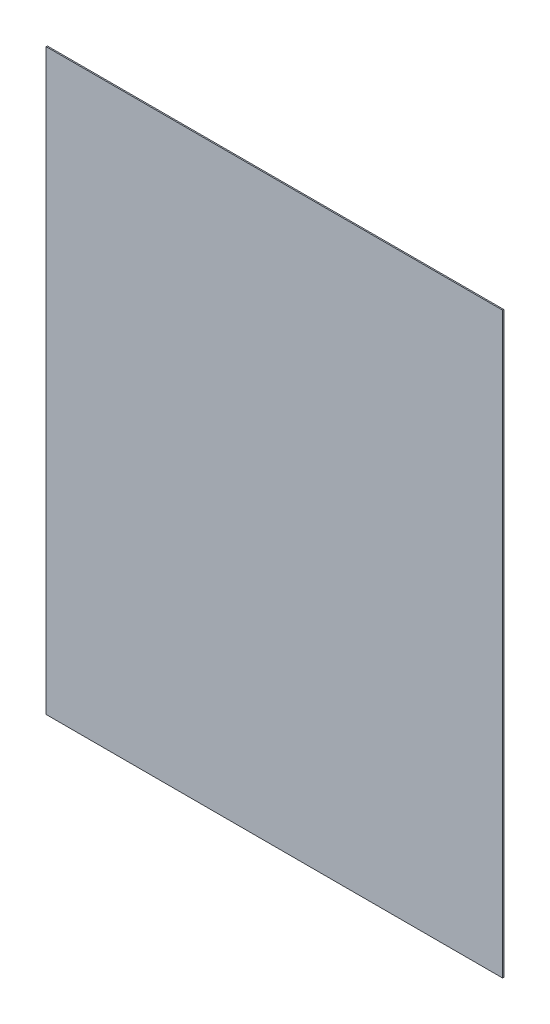
ISO-10303-21;
HEADER;
FILE_DESCRIPTION(('STEP AP214'),'2;1');
FILE_NAME('part.step','',(''),(''),'','','');
FILE_SCHEMA(('AUTOMOTIVE_DESIGN { 1 0 10303 214 1 1 1 1 }'));
ENDSEC;
DATA;
#1=APPLICATION_CONTEXT('core data for automotive mechanical design processes');
#2=APPLICATION_PROTOCOL_DEFINITION('international standard','automotive_design',2000,#1);
#3=PRODUCT_CONTEXT('',#1,'mechanical');
#4=PRODUCT('Part','Part','',(#3));
#5=PRODUCT_RELATED_PRODUCT_CATEGORY('part','',(#4));
#6=PRODUCT_DEFINITION_FORMATION('','',#4);
#7=PRODUCT_DEFINITION_CONTEXT('part definition',#1,'design');
#8=PRODUCT_DEFINITION('design','',#6,#7);
#9=PRODUCT_DEFINITION_SHAPE('','',#8);
#10=(LENGTH_UNIT() NAMED_UNIT(*) SI_UNIT(.MILLI.,.METRE.));
#11=(NAMED_UNIT(*) PLANE_ANGLE_UNIT() SI_UNIT($,.RADIAN.));
#12=(NAMED_UNIT(*) SI_UNIT($,.STERADIAN.) SOLID_ANGLE_UNIT());
#13=UNCERTAINTY_MEASURE_WITH_UNIT(LENGTH_MEASURE(1.E-05),#10,'distance_accuracy_value','');
#14=(GEOMETRIC_REPRESENTATION_CONTEXT(3) GLOBAL_UNCERTAINTY_ASSIGNED_CONTEXT((#13)) GLOBAL_UNIT_ASSIGNED_CONTEXT((#10,
#11,#12)) REPRESENTATION_CONTEXT('',''));
#15=CARTESIAN_POINT('',(0.,0.,0.));
#16=DIRECTION('',(0.,0.,1.));
#17=DIRECTION('',(1.,0.,0.));
#18=AXIS2_PLACEMENT_3D('',#15,#16,#17);
#19=CARTESIAN_POINT('',(355.,450.,1.9));
#20=DIRECTION('',(-1.,0.,0.));
#21=DIRECTION('',(0.,-1.,0.));
#22=AXIS2_PLACEMENT_3D('',#19,#20,#21);
#23=PLANE('',#22);
#24=DIRECTION('',(0.,1.,0.));
#25=VECTOR('',#24,1.);
#26=CARTESIAN_POINT('',(355.,450.,0.));
#27=LINE('',#26,#25);
#28=CARTESIAN_POINT('',(355.,-450.,0.));
#29=VERTEX_POINT('',#28);
#30=CARTESIAN_POINT('',(355.,450.,0.));
#31=VERTEX_POINT('',#30);
#32=EDGE_CURVE('E96',#29,#31,#27,.T.);
#33=ORIENTED_EDGE('',*,*,#32,.T.);
#34=DIRECTION('',(0.,0.,-1.));
#35=VECTOR('',#34,1.);
#36=CARTESIAN_POINT('',(355.,450.,1.9));
#37=LINE('',#36,#35);
#38=CARTESIAN_POINT('',(355.,450.,1.9));
#39=VERTEX_POINT('',#38);
#40=EDGE_CURVE('E11',#39,#31,#37,.T.);
#41=ORIENTED_EDGE('',*,*,#40,.F.);
#42=DIRECTION('',(0.,1.,0.));
#43=VECTOR('',#42,1.);
#44=CARTESIAN_POINT('',(355.,450.,1.9));
#45=LINE('',#44,#43);
#46=CARTESIAN_POINT('',(355.,-450.,1.9));
#47=VERTEX_POINT('',#46);
#48=EDGE_CURVE('E84',#47,#39,#45,.T.);
#49=ORIENTED_EDGE('',*,*,#48,.F.);
#50=DIRECTION('',(0.,0.,-1.));
#51=VECTOR('',#50,1.);
#52=CARTESIAN_POINT('',(355.,-450.,1.9));
#53=LINE('',#52,#51);
#54=EDGE_CURVE('E92',#47,#29,#53,.T.);
#55=ORIENTED_EDGE('',*,*,#54,.T.);
#56=EDGE_LOOP('',(#33,#41,#49,#55));
#57=FACE_BOUND('',#56,.T.);
#58=ADVANCED_FACE('F33',(#57),#23,.F.);
#59=CARTESIAN_POINT('',(-355.,450.,1.9));
#60=DIRECTION('',(0.,-1.,0.));
#61=DIRECTION('',(0.,0.,-1.));
#62=AXIS2_PLACEMENT_3D('',#59,#60,#61);
#63=PLANE('',#62);
#64=DIRECTION('',(-1.,0.,0.));
#65=VECTOR('',#64,1.);
#66=CARTESIAN_POINT('',(-355.,450.,0.));
#67=LINE('',#66,#65);
#68=CARTESIAN_POINT('',(-355.,450.,0.));
#69=VERTEX_POINT('',#68);
#70=EDGE_CURVE('E88',#31,#69,#67,.T.);
#71=ORIENTED_EDGE('',*,*,#70,.T.);
#72=DIRECTION('',(0.,0.,-1.));
#73=VECTOR('',#72,1.);
#74=CARTESIAN_POINT('',(-355.,450.,1.9));
#75=LINE('',#74,#73);
#76=CARTESIAN_POINT('',(-355.,450.,1.9));
#77=VERTEX_POINT('',#76);
#78=EDGE_CURVE('E41',#77,#69,#75,.T.);
#79=ORIENTED_EDGE('',*,*,#78,.F.);
#80=DIRECTION('',(-1.,0.,0.));
#81=VECTOR('',#80,1.);
#82=CARTESIAN_POINT('',(-355.,450.,1.9));
#83=LINE('',#82,#81);
#84=EDGE_CURVE('E79',#39,#77,#83,.T.);
#85=ORIENTED_EDGE('',*,*,#84,.F.);
#86=ORIENTED_EDGE('',*,*,#40,.T.);
#87=EDGE_LOOP('',(#71,#79,#85,#86));
#88=FACE_BOUND('',#87,.T.);
#89=ADVANCED_FACE('F87',(#88),#63,.F.);
#90=CARTESIAN_POINT('',(-355.,450.,1.9));
#91=DIRECTION('',(1.,0.,0.));
#92=DIRECTION('',(0.,1.,0.));
#93=AXIS2_PLACEMENT_3D('',#90,#91,#92);
#94=PLANE('',#93);
#95=DIRECTION('',(0.,-1.,0.));
#96=VECTOR('',#95,1.);
#97=CARTESIAN_POINT('',(-355.,450.,0.));
#98=LINE('',#97,#96);
#99=CARTESIAN_POINT('',(-355.,-450.,0.));
#100=VERTEX_POINT('',#99);
#101=EDGE_CURVE('E66',#69,#100,#98,.T.);
#102=ORIENTED_EDGE('',*,*,#101,.T.);
#103=DIRECTION('',(0.,0.,-1.));
#104=VECTOR('',#103,1.);
#105=CARTESIAN_POINT('',(-355.,-450.,1.9));
#106=LINE('',#105,#104);
#107=CARTESIAN_POINT('',(-355.,-450.,1.9));
#108=VERTEX_POINT('',#107);
#109=EDGE_CURVE('E89',#108,#100,#106,.T.);
#110=ORIENTED_EDGE('',*,*,#109,.F.);
#111=DIRECTION('',(0.,-1.,0.));
#112=VECTOR('',#111,1.);
#113=CARTESIAN_POINT('',(-355.,450.,1.9));
#114=LINE('',#113,#112);
#115=EDGE_CURVE('E82',#77,#108,#114,.T.);
#116=ORIENTED_EDGE('',*,*,#115,.F.);
#117=ORIENTED_EDGE('',*,*,#78,.T.);
#118=EDGE_LOOP('',(#102,#110,#116,#117));
#119=FACE_BOUND('',#118,.T.);
#120=ADVANCED_FACE('F90',(#119),#94,.F.);
#121=CARTESIAN_POINT('',(-355.,-450.,1.9));
#122=DIRECTION('',(0.,1.,0.));
#123=DIRECTION('',(0.,0.,1.));
#124=AXIS2_PLACEMENT_3D('',#121,#122,#123);
#125=PLANE('',#124);
#126=DIRECTION('',(1.,0.,0.));
#127=VECTOR('',#126,1.);
#128=CARTESIAN_POINT('',(-355.,-450.,0.));
#129=LINE('',#128,#127);
#130=EDGE_CURVE('E72',#100,#29,#129,.T.);
#131=ORIENTED_EDGE('',*,*,#130,.T.);
#132=ORIENTED_EDGE('',*,*,#54,.F.);
#133=DIRECTION('',(1.,0.,0.));
#134=VECTOR('',#133,1.);
#135=CARTESIAN_POINT('',(-355.,-450.,1.9));
#136=LINE('',#135,#134);
#137=EDGE_CURVE('E49',#108,#47,#136,.T.);
#138=ORIENTED_EDGE('',*,*,#137,.F.);
#139=ORIENTED_EDGE('',*,*,#109,.T.);
#140=EDGE_LOOP('',(#131,#132,#138,#139));
#141=FACE_BOUND('',#140,.T.);
#142=ADVANCED_FACE('F103',(#141),#125,.F.);
#143=CARTESIAN_POINT('',(0.,0.,1.9));
#144=DIRECTION('',(0.,0.,1.));
#145=DIRECTION('',(1.,0.,0.));
#146=AXIS2_PLACEMENT_3D('',#143,#144,#145);
#147=PLANE('',#146);
#148=ORIENTED_EDGE('',*,*,#48,.T.);
#149=ORIENTED_EDGE('',*,*,#84,.T.);
#150=ORIENTED_EDGE('',*,*,#115,.T.);
#151=ORIENTED_EDGE('',*,*,#137,.T.);
#152=EDGE_LOOP('',(#148,#149,#150,#151));
#153=FACE_BOUND('',#152,.T.);
#154=ADVANCED_FACE('F80',(#153),#147,.T.);
#155=CARTESIAN_POINT('',(0.,0.,0.));
#156=DIRECTION('',(0.,0.,1.));
#157=DIRECTION('',(1.,0.,0.));
#158=AXIS2_PLACEMENT_3D('',#155,#156,#157);
#159=PLANE('',#158);
#160=ORIENTED_EDGE('',*,*,#32,.F.);
#161=ORIENTED_EDGE('',*,*,#130,.F.);
#162=ORIENTED_EDGE('',*,*,#101,.F.);
#163=ORIENTED_EDGE('',*,*,#70,.F.);
#164=EDGE_LOOP('',(#160,#161,#162,#163));
#165=FACE_BOUND('',#164,.T.);
#166=ADVANCED_FACE('F106',(#165),#159,.F.);
#167=CLOSED_SHELL('',(#58,#89,#120,#142,#154,#166));
#168=MANIFOLD_SOLID_BREP('B2',#167);
#169=ADVANCED_BREP_SHAPE_REPRESENTATION('',(#18,#168),#14);
#170=SHAPE_DEFINITION_REPRESENTATION(#9,#169);
ENDSEC;
END-ISO-10303-21;
